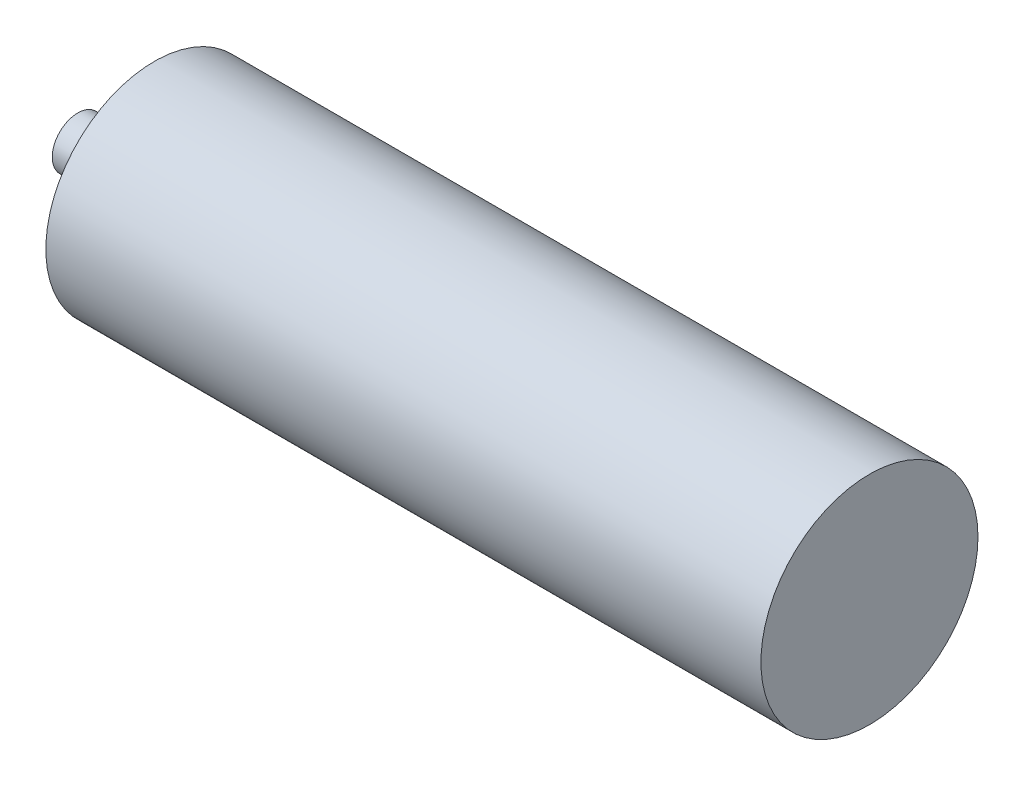
ISO-10303-21;
HEADER;
FILE_DESCRIPTION(('STEP AP214'),'2;1');
FILE_NAME('part.step','',(''),(''),'','','');
FILE_SCHEMA(('AUTOMOTIVE_DESIGN { 1 0 10303 214 1 1 1 1 }'));
ENDSEC;
DATA;
#1=APPLICATION_CONTEXT('core data for automotive mechanical design processes');
#2=APPLICATION_PROTOCOL_DEFINITION('international standard','automotive_design',2000,#1);
#3=PRODUCT_CONTEXT('',#1,'mechanical');
#4=PRODUCT('Part','Part','',(#3));
#5=PRODUCT_RELATED_PRODUCT_CATEGORY('part','',(#4));
#6=PRODUCT_DEFINITION_FORMATION('','',#4);
#7=PRODUCT_DEFINITION_CONTEXT('part definition',#1,'design');
#8=PRODUCT_DEFINITION('design','',#6,#7);
#9=PRODUCT_DEFINITION_SHAPE('','',#8);
#10=(LENGTH_UNIT() NAMED_UNIT(*) SI_UNIT(.MILLI.,.METRE.));
#11=(NAMED_UNIT(*) PLANE_ANGLE_UNIT() SI_UNIT($,.RADIAN.));
#12=(NAMED_UNIT(*) SI_UNIT($,.STERADIAN.) SOLID_ANGLE_UNIT());
#13=UNCERTAINTY_MEASURE_WITH_UNIT(LENGTH_MEASURE(1.E-05),#10,'distance_accuracy_value','');
#14=(GEOMETRIC_REPRESENTATION_CONTEXT(3) GLOBAL_UNCERTAINTY_ASSIGNED_CONTEXT((#13)) GLOBAL_UNIT_ASSIGNED_CONTEXT((#10,
#11,#12)) REPRESENTATION_CONTEXT('',''));
#15=CARTESIAN_POINT('',(0.,0.,0.));
#16=DIRECTION('',(0.,0.,1.));
#17=DIRECTION('',(1.,0.,0.));
#18=AXIS2_PLACEMENT_3D('',#15,#16,#17);
#19=CARTESIAN_POINT('',(177.8,-10.2712746451314,8.87438129339355));
#20=DIRECTION('',(-1.,0.,0.));
#21=DIRECTION('',(0.,0.,1.));
#22=AXIS2_PLACEMENT_3D('',#19,#20,#21);
#23=CYLINDRICAL_SURFACE('',#22,26.9875);
#24=CARTESIAN_POINT('',(177.8,-10.2712746451314,8.87438129339355));
#25=DIRECTION('',(1.,0.,0.));
#26=DIRECTION('',(0.,0.,-1.));
#27=AXIS2_PLACEMENT_3D('',#24,#25,#26);
#28=CIRCLE('',#27,26.9875);
#29=CARTESIAN_POINT('',(177.8,-10.2712746451314,-18.1131187066064));
#30=VERTEX_POINT('',#29);
#31=EDGE_CURVE('E45',#30,#30,#28,.T.);
#32=ORIENTED_EDGE('',*,*,#31,.F.);
#33=EDGE_LOOP('',(#32));
#34=FACE_BOUND('',#33,.T.);
#35=CARTESIAN_POINT('',(0.,-10.2712746451314,8.87438129339355));
#36=DIRECTION('',(1.,0.,0.));
#37=DIRECTION('',(0.,0.,-1.));
#38=AXIS2_PLACEMENT_3D('',#35,#36,#37);
#39=CIRCLE('',#38,26.9875);
#40=CARTESIAN_POINT('',(0.,-10.2712746451314,-18.1131187066064));
#41=VERTEX_POINT('',#40);
#42=EDGE_CURVE('E41',#41,#41,#39,.T.);
#43=ORIENTED_EDGE('',*,*,#42,.T.);
#44=EDGE_LOOP('',(#43));
#45=FACE_BOUND('',#44,.T.);
#46=ADVANCED_FACE('F38',(#34,#45),#23,.T.);
#47=CARTESIAN_POINT('',(177.8,-10.2712746451314,8.87438129339355));
#48=DIRECTION('',(1.,0.,0.));
#49=DIRECTION('',(0.,0.,-1.));
#50=AXIS2_PLACEMENT_3D('',#47,#48,#49);
#51=PLANE('',#50);
#52=ORIENTED_EDGE('',*,*,#31,.T.);
#53=EDGE_LOOP('',(#52));
#54=FACE_BOUND('',#53,.T.);
#55=ADVANCED_FACE('F62',(#54),#51,.T.);
#56=CARTESIAN_POINT('',(0.,-10.2712746451314,8.87438129339355));
#57=DIRECTION('',(1.,0.,0.));
#58=DIRECTION('',(0.,0.,-1.));
#59=AXIS2_PLACEMENT_3D('',#56,#57,#58);
#60=PLANE('',#59);
#61=CARTESIAN_POINT('',(0.,-10.2712746451314,8.87438129339355));
#62=DIRECTION('',(-1.,0.,0.));
#63=DIRECTION('',(0.,0.,1.));
#64=AXIS2_PLACEMENT_3D('',#61,#62,#63);
#65=CIRCLE('',#64,6.35);
#66=CARTESIAN_POINT('',(0.,-10.2712746451314,2.52438129339355));
#67=VERTEX_POINT('',#66);
#68=EDGE_CURVE('E10',#67,#67,#65,.T.);
#69=ORIENTED_EDGE('',*,*,#68,.F.);
#70=EDGE_LOOP('',(#69));
#71=FACE_BOUND('',#70,.T.);
#72=ORIENTED_EDGE('',*,*,#42,.F.);
#73=EDGE_LOOP('',(#72));
#74=FACE_BOUND('',#73,.T.);
#75=ADVANCED_FACE('F59',(#71,#74),#60,.F.);
#76=CARTESIAN_POINT('',(-19.05,-10.2712746451314,8.87438129339355));
#77=DIRECTION('',(1.,0.,0.));
#78=DIRECTION('',(0.,0.,-1.));
#79=AXIS2_PLACEMENT_3D('',#76,#77,#78);
#80=CYLINDRICAL_SURFACE('',#79,6.35);
#81=CARTESIAN_POINT('',(-19.05,-10.2712746451314,8.87438129339355));
#82=DIRECTION('',(-1.,0.,0.));
#83=DIRECTION('',(0.,0.,1.));
#84=AXIS2_PLACEMENT_3D('',#81,#82,#83);
#85=CIRCLE('',#84,6.35);
#86=CARTESIAN_POINT('',(-19.05,-10.2712746451314,2.52438129339355));
#87=VERTEX_POINT('',#86);
#88=EDGE_CURVE('E51',#87,#87,#85,.T.);
#89=CARTESIAN_POINT('',(-19.05,-10.2712746451314,2.52438129339355));
#90=CARTESIAN_POINT('',(-18.8515625,-10.2712746451314,2.52438129339355));
#91=CARTESIAN_POINT('',(-18.653125,-10.2712746451314,2.52438129339355));
#92=CARTESIAN_POINT('',(-18.25625,-10.2712746451314,2.52438129339355));
#93=CARTESIAN_POINT('',(-18.0578125,-10.2712746451314,2.52438129339355));
#94=CARTESIAN_POINT('',(-17.6609375,-10.2712746451314,2.52438129339355));
#95=CARTESIAN_POINT('',(-17.4625,-10.2712746451314,2.52438129339355));
#96=CARTESIAN_POINT('',(-17.065625,-10.2712746451314,2.52438129339355));
#97=CARTESIAN_POINT('',(-16.8671875,-10.2712746451314,2.52438129339355));
#98=CARTESIAN_POINT('',(-16.4703125,-10.2712746451314,2.52438129339355));
#99=CARTESIAN_POINT('',(-16.271875,-10.2712746451314,2.52438129339355));
#100=CARTESIAN_POINT('',(-15.875,-10.2712746451314,2.52438129339355));
#101=CARTESIAN_POINT('',(-15.6765625,-10.2712746451314,2.52438129339355));
#102=CARTESIAN_POINT('',(-15.2796875,-10.2712746451314,2.52438129339355));
#103=CARTESIAN_POINT('',(-15.08125,-10.2712746451314,2.52438129339355));
#104=CARTESIAN_POINT('',(-14.684375,-10.2712746451314,2.52438129339355));
#105=CARTESIAN_POINT('',(-14.4859375,-10.2712746451314,2.52438129339355));
#106=CARTESIAN_POINT('',(-14.0890625,-10.2712746451314,2.52438129339355));
#107=CARTESIAN_POINT('',(-13.890625,-10.2712746451314,2.52438129339355));
#108=CARTESIAN_POINT('',(-13.49375,-10.2712746451314,2.52438129339355));
#109=CARTESIAN_POINT('',(-13.2953125,-10.2712746451314,2.52438129339355));
#110=CARTESIAN_POINT('',(-12.8984375,-10.2712746451314,2.52438129339355));
#111=CARTESIAN_POINT('',(-12.7,-10.2712746451314,2.52438129339355));
#112=CARTESIAN_POINT('',(-12.303125,-10.2712746451314,2.52438129339355));
#113=CARTESIAN_POINT('',(-12.1046875,-10.2712746451314,2.52438129339355));
#114=CARTESIAN_POINT('',(-11.7078125,-10.2712746451314,2.52438129339355));
#115=CARTESIAN_POINT('',(-11.509375,-10.2712746451314,2.52438129339355));
#116=CARTESIAN_POINT('',(-11.1125,-10.2712746451314,2.52438129339355));
#117=CARTESIAN_POINT('',(-10.9140625,-10.2712746451314,2.52438129339355));
#118=CARTESIAN_POINT('',(-10.5171875,-10.2712746451314,2.52438129339355));
#119=CARTESIAN_POINT('',(-10.31875,-10.2712746451314,2.52438129339355));
#120=CARTESIAN_POINT('',(-9.921875,-10.2712746451314,2.52438129339355));
#121=CARTESIAN_POINT('',(-9.7234375,-10.2712746451314,2.52438129339355));
#122=CARTESIAN_POINT('',(-9.3265625,-10.2712746451314,2.52438129339355));
#123=CARTESIAN_POINT('',(-9.128125,-10.2712746451314,2.52438129339355));
#124=CARTESIAN_POINT('',(-8.73125,-10.2712746451314,2.52438129339355));
#125=CARTESIAN_POINT('',(-8.5328125,-10.2712746451314,2.52438129339355));
#126=CARTESIAN_POINT('',(-8.1359375,-10.2712746451314,2.52438129339355));
#127=CARTESIAN_POINT('',(-7.9375,-10.2712746451314,2.52438129339355));
#128=CARTESIAN_POINT('',(-7.540625,-10.2712746451314,2.52438129339355));
#129=CARTESIAN_POINT('',(-7.3421875,-10.2712746451314,2.52438129339355));
#130=CARTESIAN_POINT('',(-6.9453125,-10.2712746451314,2.52438129339355));
#131=CARTESIAN_POINT('',(-6.746875,-10.2712746451314,2.52438129339355));
#132=CARTESIAN_POINT('',(-6.35,-10.2712746451314,2.52438129339355));
#133=CARTESIAN_POINT('',(-6.1515625,-10.2712746451314,2.52438129339355));
#134=CARTESIAN_POINT('',(-5.7546875,-10.2712746451314,2.52438129339355));
#135=CARTESIAN_POINT('',(-5.55625,-10.2712746451314,2.52438129339355));
#136=CARTESIAN_POINT('',(-5.159375,-10.2712746451314,2.52438129339355));
#137=CARTESIAN_POINT('',(-4.9609375,-10.2712746451314,2.52438129339355));
#138=CARTESIAN_POINT('',(-4.5640625,-10.2712746451314,2.52438129339355));
#139=CARTESIAN_POINT('',(-4.365625,-10.2712746451314,2.52438129339355));
#140=CARTESIAN_POINT('',(-3.96875,-10.2712746451314,2.52438129339355));
#141=CARTESIAN_POINT('',(-3.7703125,-10.2712746451314,2.52438129339355));
#142=CARTESIAN_POINT('',(-3.3734375,-10.2712746451314,2.52438129339355));
#143=CARTESIAN_POINT('',(-3.175,-10.2712746451314,2.52438129339355));
#144=CARTESIAN_POINT('',(-2.778125,-10.2712746451314,2.52438129339355));
#145=CARTESIAN_POINT('',(-2.5796875,-10.2712746451314,2.52438129339355));
#146=CARTESIAN_POINT('',(-2.1828125,-10.2712746451314,2.52438129339355));
#147=CARTESIAN_POINT('',(-1.984375,-10.2712746451314,2.52438129339355));
#148=CARTESIAN_POINT('',(-1.5875,-10.2712746451314,2.52438129339355));
#149=CARTESIAN_POINT('',(-1.3890625,-10.2712746451314,2.52438129339355));
#150=CARTESIAN_POINT('',(-0.992187500000001,-10.2712746451314,2.52438129339355));
#151=CARTESIAN_POINT('',(-0.793750000000001,-10.2712746451314,2.52438129339355));
#152=CARTESIAN_POINT('',(-0.396875,-10.2712746451314,2.52438129339355));
#153=CARTESIAN_POINT('',(-0.1984375,-10.2712746451314,2.52438129339355));
#154=CARTESIAN_POINT('',(0.,-10.2712746451314,2.52438129339355));
#155=B_SPLINE_CURVE_WITH_KNOTS('',3,(#89,#90,#91,#92,#93,#94,#95,#96,#97,#98,#99,#100,#101,#102,
#103,#104,#105,#106,#107,#108,#109,#110,#111,#112,#113,#114,#115,#116,#117,#118,#119,#120,#121,
#122,#123,#124,#125,#126,#127,#128,#129,#130,#131,#132,#133,#134,#135,#136,#137,#138,#139,#140,
#141,#142,#143,#144,#145,#146,#147,#148,#149,#150,#151,#152,#153,#154),.UNSPECIFIED.,.F.,.F.,(4,
2,2,2,2,2,2,2,2,2,2,2,2,2,2,2,2,2,2,2,2,2,2,2,2,2,2,2,2,2,2,2,4),(0.,0.5953125,1.190625,
1.7859375,2.38125,2.9765625,3.571875,4.1671875,4.7625,5.3578125,5.953125,6.5484375,7.14375,
7.7390625,8.334375,8.9296875,9.525,10.1203125,10.715625,11.3109375,11.90625,12.5015625,
13.096875,13.6921875,14.2875,14.8828125,15.478125,16.0734375,16.66875,17.2640625,17.859375,
18.4546875,19.05),.UNSPECIFIED.);
#156=EDGE_CURVE('BSEAM61',#87,#67,#155,.T.);
#157=ORIENTED_EDGE('',*,*,#88,.F.);
#158=ORIENTED_EDGE('',*,*,#68,.T.);
#159=ORIENTED_EDGE('',*,*,#156,.T.);
#160=ORIENTED_EDGE('',*,*,#156,.F.);
#161=EDGE_LOOP('',(#157,#159,#158,#160));
#162=FACE_BOUND('',#161,.T.);
#163=ADVANCED_FACE('F61',(#162),#80,.T.);
#164=CARTESIAN_POINT('',(-19.05,-10.2712746451314,8.87438129339355));
#165=DIRECTION('',(-1.,0.,0.));
#166=DIRECTION('',(0.,0.,1.));
#167=AXIS2_PLACEMENT_3D('',#164,#165,#166);
#168=PLANE('',#167);
#169=ORIENTED_EDGE('',*,*,#88,.T.);
#170=EDGE_LOOP('',(#169));
#171=FACE_BOUND('',#170,.T.);
#172=ADVANCED_FACE('F68',(#171),#168,.T.);
#173=CLOSED_SHELL('',(#46,#55,#75,#163,#172));
#174=MANIFOLD_SOLID_BREP('B2',#173);
#175=ADVANCED_BREP_SHAPE_REPRESENTATION('',(#18,#174),#14);
#176=SHAPE_DEFINITION_REPRESENTATION(#9,#175);
ENDSEC;
END-ISO-10303-21;
